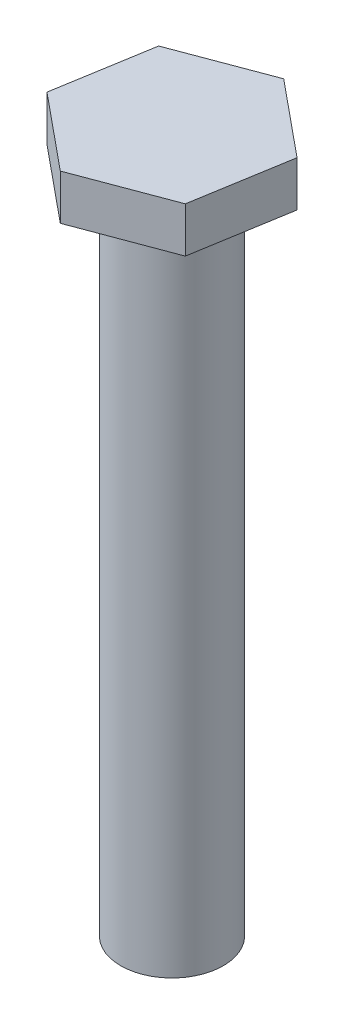
ISO-10303-21;
HEADER;
FILE_DESCRIPTION(('STEP AP214'),'2;1');
FILE_NAME('part.step','',(''),(''),'','','');
FILE_SCHEMA(('AUTOMOTIVE_DESIGN { 1 0 10303 214 1 1 1 1 }'));
ENDSEC;
DATA;
#1=APPLICATION_CONTEXT('core data for automotive mechanical design processes');
#2=APPLICATION_PROTOCOL_DEFINITION('international standard','automotive_design',2000,#1);
#3=PRODUCT_CONTEXT('',#1,'mechanical');
#4=PRODUCT('Part','Part','',(#3));
#5=PRODUCT_RELATED_PRODUCT_CATEGORY('part','',(#4));
#6=PRODUCT_DEFINITION_FORMATION('','',#4);
#7=PRODUCT_DEFINITION_CONTEXT('part definition',#1,'design');
#8=PRODUCT_DEFINITION('design','',#6,#7);
#9=PRODUCT_DEFINITION_SHAPE('','',#8);
#10=(LENGTH_UNIT() NAMED_UNIT(*) SI_UNIT(.MILLI.,.METRE.));
#11=(NAMED_UNIT(*) PLANE_ANGLE_UNIT() SI_UNIT($,.RADIAN.));
#12=(NAMED_UNIT(*) SI_UNIT($,.STERADIAN.) SOLID_ANGLE_UNIT());
#13=UNCERTAINTY_MEASURE_WITH_UNIT(LENGTH_MEASURE(1.E-05),#10,'distance_accuracy_value','');
#14=(GEOMETRIC_REPRESENTATION_CONTEXT(3) GLOBAL_UNCERTAINTY_ASSIGNED_CONTEXT((#13)) GLOBAL_UNIT_ASSIGNED_CONTEXT((#10,
#11,#12)) REPRESENTATION_CONTEXT('',''));
#15=CARTESIAN_POINT('',(0.,0.,0.));
#16=DIRECTION('',(0.,0.,1.));
#17=DIRECTION('',(1.,0.,0.));
#18=AXIS2_PLACEMENT_3D('',#15,#16,#17);
#19=CARTESIAN_POINT('',(0.,-101.6,0.));
#20=DIRECTION('',(0.,1.,0.));
#21=DIRECTION('',(0.,0.,1.));
#22=AXIS2_PLACEMENT_3D('',#19,#20,#21);
#23=CYLINDRICAL_SURFACE('',#22,7.9375);
#24=CARTESIAN_POINT('',(0.,-101.6,0.));
#25=DIRECTION('',(0.,1.,0.));
#26=DIRECTION('',(0.,0.,1.));
#27=AXIS2_PLACEMENT_3D('',#24,#25,#26);
#28=CIRCLE('',#27,7.9375);
#29=CARTESIAN_POINT('',(0.,-101.6,7.9375));
#30=VERTEX_POINT('',#29);
#31=EDGE_CURVE('E11',#30,#30,#28,.T.);
#32=CARTESIAN_POINT('',(0.,0.,0.));
#33=DIRECTION('',(0.,1.,0.));
#34=DIRECTION('',(0.,0.,1.));
#35=AXIS2_PLACEMENT_3D('',#32,#33,#34);
#36=CIRCLE('',#35,7.9375);
#37=CARTESIAN_POINT('',(0.,0.,7.9375));
#38=VERTEX_POINT('',#37);
#39=EDGE_CURVE('E35',#38,#38,#36,.T.);
#40=CARTESIAN_POINT('',(0.,-101.6,7.9375));
#41=CARTESIAN_POINT('',(0.,-100.541666666667,7.9375));
#42=CARTESIAN_POINT('',(0.,-99.4833333333333,7.9375));
#43=CARTESIAN_POINT('',(0.,-97.3666666666667,7.9375));
#44=CARTESIAN_POINT('',(0.,-96.3083333333333,7.9375));
#45=CARTESIAN_POINT('',(0.,-94.1916666666667,7.9375));
#46=CARTESIAN_POINT('',(0.,-93.1333333333333,7.9375));
#47=CARTESIAN_POINT('',(0.,-91.0166666666667,7.9375));
#48=CARTESIAN_POINT('',(0.,-89.9583333333333,7.9375));
#49=CARTESIAN_POINT('',(0.,-87.8416666666667,7.9375));
#50=CARTESIAN_POINT('',(0.,-86.7833333333333,7.9375));
#51=CARTESIAN_POINT('',(0.,-84.6666666666667,7.9375));
#52=CARTESIAN_POINT('',(0.,-83.6083333333333,7.9375));
#53=CARTESIAN_POINT('',(0.,-81.4916666666667,7.9375));
#54=CARTESIAN_POINT('',(0.,-80.4333333333333,7.9375));
#55=CARTESIAN_POINT('',(0.,-78.3166666666667,7.9375));
#56=CARTESIAN_POINT('',(0.,-77.2583333333333,7.9375));
#57=CARTESIAN_POINT('',(0.,-75.1416666666667,7.9375));
#58=CARTESIAN_POINT('',(0.,-74.0833333333333,7.9375));
#59=CARTESIAN_POINT('',(0.,-71.9666666666667,7.9375));
#60=CARTESIAN_POINT('',(0.,-70.9083333333333,7.9375));
#61=CARTESIAN_POINT('',(0.,-68.7916666666667,7.9375));
#62=CARTESIAN_POINT('',(0.,-67.7333333333333,7.9375));
#63=CARTESIAN_POINT('',(0.,-65.6166666666667,7.9375));
#64=CARTESIAN_POINT('',(0.,-64.5583333333333,7.9375));
#65=CARTESIAN_POINT('',(0.,-62.4416666666667,7.9375));
#66=CARTESIAN_POINT('',(0.,-61.3833333333333,7.9375));
#67=CARTESIAN_POINT('',(0.,-59.2666666666667,7.9375));
#68=CARTESIAN_POINT('',(0.,-58.2083333333333,7.9375));
#69=CARTESIAN_POINT('',(0.,-56.0916666666667,7.9375));
#70=CARTESIAN_POINT('',(0.,-55.0333333333333,7.9375));
#71=CARTESIAN_POINT('',(0.,-52.9166666666667,7.9375));
#72=CARTESIAN_POINT('',(0.,-51.8583333333333,7.9375));
#73=CARTESIAN_POINT('',(0.,-49.7416666666667,7.9375));
#74=CARTESIAN_POINT('',(0.,-48.6833333333333,7.9375));
#75=CARTESIAN_POINT('',(0.,-46.5666666666667,7.9375));
#76=CARTESIAN_POINT('',(0.,-45.5083333333333,7.9375));
#77=CARTESIAN_POINT('',(0.,-43.3916666666667,7.9375));
#78=CARTESIAN_POINT('',(0.,-42.3333333333333,7.9375));
#79=CARTESIAN_POINT('',(0.,-40.2166666666667,7.9375));
#80=CARTESIAN_POINT('',(0.,-39.1583333333333,7.9375));
#81=CARTESIAN_POINT('',(0.,-37.0416666666667,7.9375));
#82=CARTESIAN_POINT('',(0.,-35.9833333333333,7.9375));
#83=CARTESIAN_POINT('',(0.,-33.8666666666667,7.9375));
#84=CARTESIAN_POINT('',(0.,-32.8083333333334,7.9375));
#85=CARTESIAN_POINT('',(0.,-30.6916666666667,7.9375));
#86=CARTESIAN_POINT('',(0.,-29.6333333333333,7.9375));
#87=CARTESIAN_POINT('',(0.,-27.5166666666667,7.9375));
#88=CARTESIAN_POINT('',(0.,-26.4583333333333,7.9375));
#89=CARTESIAN_POINT('',(0.,-24.3416666666667,7.9375));
#90=CARTESIAN_POINT('',(0.,-23.2833333333333,7.9375));
#91=CARTESIAN_POINT('',(0.,-21.1666666666667,7.9375));
#92=CARTESIAN_POINT('',(0.,-20.1083333333333,7.9375));
#93=CARTESIAN_POINT('',(0.,-17.9916666666667,7.9375));
#94=CARTESIAN_POINT('',(0.,-16.9333333333333,7.9375));
#95=CARTESIAN_POINT('',(0.,-14.8166666666667,7.9375));
#96=CARTESIAN_POINT('',(0.,-13.7583333333333,7.9375));
#97=CARTESIAN_POINT('',(0.,-11.6416666666667,7.9375));
#98=CARTESIAN_POINT('',(0.,-10.5833333333333,7.9375));
#99=CARTESIAN_POINT('',(0.,-8.46666666666667,7.9375));
#100=CARTESIAN_POINT('',(0.,-7.40833333333334,7.9375));
#101=CARTESIAN_POINT('',(0.,-5.29166666666667,7.9375));
#102=CARTESIAN_POINT('',(0.,-4.23333333333333,7.9375));
#103=CARTESIAN_POINT('',(0.,-2.11666666666666,7.9375));
#104=CARTESIAN_POINT('',(0.,-1.05833333333333,7.9375));
#105=CARTESIAN_POINT('',(0.,0.,7.9375));
#106=B_SPLINE_CURVE_WITH_KNOTS('',3,(#40,#41,#42,#43,#44,#45,#46,#47,#48,#49,#50,#51,#52,#53,
#54,#55,#56,#57,#58,#59,#60,#61,#62,#63,#64,#65,#66,#67,#68,#69,#70,#71,#72,#73,#74,#75,#76,#77,
#78,#79,#80,#81,#82,#83,#84,#85,#86,#87,#88,#89,#90,#91,#92,#93,#94,#95,#96,#97,#98,#99,#100,
#101,#102,#103,#104,#105),.UNSPECIFIED.,.F.,.F.,(4,2,2,2,2,2,2,2,2,2,2,2,2,2,2,2,2,2,2,2,2,2,2,
2,2,2,2,2,2,2,2,2,4),(0.,3.17500000000001,6.35000000000001,9.52500000000001,12.7,15.875,19.05,
22.225,25.4,28.575,31.75,34.925,38.1,41.275,44.45,47.625,50.8,53.975,57.15,60.325,63.5,66.675,
69.85,73.025,76.2,79.375,82.55,85.725,88.9,92.075,95.25,98.425,101.6),.UNSPECIFIED.);
#107=EDGE_CURVE('BSEAM32',#30,#38,#106,.T.);
#108=ORIENTED_EDGE('',*,*,#31,.T.);
#109=ORIENTED_EDGE('',*,*,#39,.F.);
#110=ORIENTED_EDGE('',*,*,#107,.T.);
#111=ORIENTED_EDGE('',*,*,#107,.F.);
#112=EDGE_LOOP('',(#108,#110,#109,#111));
#113=FACE_BOUND('',#112,.T.);
#114=ADVANCED_FACE('F32',(#113),#23,.T.);
#115=CARTESIAN_POINT('',(0.,-101.6,0.));
#116=DIRECTION('',(0.,1.,0.));
#117=DIRECTION('',(0.,0.,1.));
#118=AXIS2_PLACEMENT_3D('',#115,#116,#117);
#119=PLANE('',#118);
#120=ORIENTED_EDGE('',*,*,#31,.F.);
#121=EDGE_LOOP('',(#120));
#122=FACE_BOUND('',#121,.T.);
#123=ADVANCED_FACE('F143',(#122),#119,.F.);
#124=CARTESIAN_POINT('',(-2.45878019902812,7.,14.8083670020094));
#125=DIRECTION('',(-0.351394296683121,0.,-0.936227562219023));
#126=DIRECTION('',(-0.936227562219023,0.,0.351394296683121));
#127=AXIS2_PLACEMENT_3D('',#124,#125,#126);
#128=PLANE('',#127);
#129=DIRECTION('',(0.936227562219023,0.,-0.351394296683121));
#130=VECTOR('',#129,1.);
#131=CARTESIAN_POINT('',(-2.45878019902812,0.,14.8083670020094));
#132=LINE('',#131,#130);
#133=CARTESIAN_POINT('',(-2.45878019902812,0.,14.8083670020094));
#134=VERTEX_POINT('',#133);
#135=CARTESIAN_POINT('',(11.5950319127893,0.,9.5335496156852));
#136=VERTEX_POINT('',#135);
#137=EDGE_CURVE('E117',#134,#136,#132,.T.);
#138=ORIENTED_EDGE('',*,*,#137,.T.);
#139=DIRECTION('',(0.,-1.,0.));
#140=VECTOR('',#139,1.);
#141=CARTESIAN_POINT('',(11.5950319127893,7.,9.5335496156852));
#142=LINE('',#141,#140);
#143=CARTESIAN_POINT('',(11.5950319127893,7.,9.5335496156852));
#144=VERTEX_POINT('',#143);
#145=EDGE_CURVE('E134',#144,#136,#142,.T.);
#146=ORIENTED_EDGE('',*,*,#145,.F.);
#147=DIRECTION('',(0.936227562219023,0.,-0.351394296683121));
#148=VECTOR('',#147,1.);
#149=CARTESIAN_POINT('',(-2.45878019902812,7.,14.8083670020094));
#150=LINE('',#149,#148);
#151=CARTESIAN_POINT('',(-2.45878019902812,7.,14.8083670020094));
#152=VERTEX_POINT('',#151);
#153=EDGE_CURVE('E127',#152,#144,#150,.T.);
#154=ORIENTED_EDGE('',*,*,#153,.F.);
#155=DIRECTION('',(0.,-1.,0.));
#156=VECTOR('',#155,1.);
#157=CARTESIAN_POINT('',(-2.45878019902812,7.,14.8083670020094));
#158=LINE('',#157,#156);
#159=EDGE_CURVE('E113',#152,#134,#158,.T.);
#160=ORIENTED_EDGE('',*,*,#159,.T.);
#161=EDGE_LOOP('',(#138,#146,#154,#160));
#162=FACE_BOUND('',#161,.T.);
#163=ADVANCED_FACE('F148',(#162),#128,.F.);
#164=CARTESIAN_POINT('',(11.5950319127893,7.,9.5335496156852));
#165=DIRECTION('',(-0.986494000946411,0.,-0.163797393436962));
#166=DIRECTION('',(-0.163797393436962,0.,0.986494000946411));
#167=AXIS2_PLACEMENT_3D('',#164,#165,#166);
#168=PLANE('',#167);
#169=DIRECTION('',(0.163797393436962,0.,-0.986494000946411));
#170=VECTOR('',#169,1.);
#171=CARTESIAN_POINT('',(11.5950319127893,0.,9.5335496156852));
#172=LINE('',#171,#170);
#173=CARTESIAN_POINT('',(14.0538121118174,0.,-5.27481738632418));
#174=VERTEX_POINT('',#173);
#175=EDGE_CURVE('E120',#136,#174,#172,.T.);
#176=ORIENTED_EDGE('',*,*,#175,.T.);
#177=DIRECTION('',(0.,-1.,0.));
#178=VECTOR('',#177,1.);
#179=CARTESIAN_POINT('',(14.0538121118174,7.,-5.27481738632418));
#180=LINE('',#179,#178);
#181=CARTESIAN_POINT('',(14.0538121118174,7.,-5.27481738632418));
#182=VERTEX_POINT('',#181);
#183=EDGE_CURVE('E131',#182,#174,#180,.T.);
#184=ORIENTED_EDGE('',*,*,#183,.F.);
#185=DIRECTION('',(0.163797393436962,0.,-0.986494000946411));
#186=VECTOR('',#185,1.);
#187=CARTESIAN_POINT('',(11.5950319127893,7.,9.5335496156852));
#188=LINE('',#187,#186);
#189=EDGE_CURVE('E86',#144,#182,#188,.T.);
#190=ORIENTED_EDGE('',*,*,#189,.F.);
#191=ORIENTED_EDGE('',*,*,#145,.T.);
#192=EDGE_LOOP('',(#176,#184,#190,#191));
#193=FACE_BOUND('',#192,.T.);
#194=ADVANCED_FACE('F154',(#193),#168,.F.);
#195=CARTESIAN_POINT('',(14.0538121118174,7.,-5.27481738632418));
#196=DIRECTION('',(-0.63509970426329,0.,0.77243016878206));
#197=DIRECTION('',(0.77243016878206,0.,0.63509970426329));
#198=AXIS2_PLACEMENT_3D('',#195,#196,#197);
#199=PLANE('',#198);
#200=DIRECTION('',(-0.77243016878206,0.,-0.635099704263289));
#201=VECTOR('',#200,1.);
#202=CARTESIAN_POINT('',(14.0538121118174,0.,-5.27481738632418));
#203=LINE('',#202,#201);
#204=CARTESIAN_POINT('',(2.45878019902812,0.,-14.8083670020094));
#205=VERTEX_POINT('',#204);
#206=EDGE_CURVE('E122',#174,#205,#203,.T.);
#207=ORIENTED_EDGE('',*,*,#206,.T.);
#208=DIRECTION('',(0.,-1.,0.));
#209=VECTOR('',#208,1.);
#210=CARTESIAN_POINT('',(2.45878019902812,7.,-14.8083670020094));
#211=LINE('',#210,#209);
#212=CARTESIAN_POINT('',(2.45878019902812,7.,-14.8083670020094));
#213=VERTEX_POINT('',#212);
#214=EDGE_CURVE('E108',#213,#205,#211,.T.);
#215=ORIENTED_EDGE('',*,*,#214,.F.);
#216=DIRECTION('',(-0.77243016878206,0.,-0.635099704263289));
#217=VECTOR('',#216,1.);
#218=CARTESIAN_POINT('',(14.0538121118174,7.,-5.27481738632418));
#219=LINE('',#218,#217);
#220=EDGE_CURVE('E99',#182,#213,#219,.T.);
#221=ORIENTED_EDGE('',*,*,#220,.F.);
#222=ORIENTED_EDGE('',*,*,#183,.T.);
#223=EDGE_LOOP('',(#207,#215,#221,#222));
#224=FACE_BOUND('',#223,.T.);
#225=ADVANCED_FACE('F160',(#224),#199,.F.);
#226=CARTESIAN_POINT('',(2.45878019902812,7.,-14.8083670020094));
#227=DIRECTION('',(0.351394296683121,0.,0.936227562219023));
#228=DIRECTION('',(0.936227562219023,0.,-0.351394296683121));
#229=AXIS2_PLACEMENT_3D('',#226,#227,#228);
#230=PLANE('',#229);
#231=DIRECTION('',(-0.936227562219023,0.,0.351394296683121));
#232=VECTOR('',#231,1.);
#233=CARTESIAN_POINT('',(2.45878019902812,0.,-14.8083670020094));
#234=LINE('',#233,#232);
#235=CARTESIAN_POINT('',(-11.5950319127893,0.,-9.53354961568521));
#236=VERTEX_POINT('',#235);
#237=EDGE_CURVE('E107',#205,#236,#234,.T.);
#238=ORIENTED_EDGE('',*,*,#237,.T.);
#239=DIRECTION('',(0.,-1.,0.));
#240=VECTOR('',#239,1.);
#241=CARTESIAN_POINT('',(-11.5950319127893,7.,-9.53354961568521));
#242=LINE('',#241,#240);
#243=CARTESIAN_POINT('',(-11.5950319127893,7.,-9.53354961568521));
#244=VERTEX_POINT('',#243);
#245=EDGE_CURVE('E104',#244,#236,#242,.T.);
#246=ORIENTED_EDGE('',*,*,#245,.F.);
#247=DIRECTION('',(-0.936227562219023,0.,0.351394296683121));
#248=VECTOR('',#247,1.);
#249=CARTESIAN_POINT('',(2.45878019902812,7.,-14.8083670020094));
#250=LINE('',#249,#248);
#251=EDGE_CURVE('E93',#213,#244,#250,.T.);
#252=ORIENTED_EDGE('',*,*,#251,.F.);
#253=ORIENTED_EDGE('',*,*,#214,.T.);
#254=EDGE_LOOP('',(#238,#246,#252,#253));
#255=FACE_BOUND('',#254,.T.);
#256=ADVANCED_FACE('F105',(#255),#230,.F.);
#257=CARTESIAN_POINT('',(-11.5950319127893,7.,-9.53354961568521));
#258=DIRECTION('',(0.986494000946411,0.,0.163797393436963));
#259=DIRECTION('',(0.163797393436963,0.,-0.986494000946411));
#260=AXIS2_PLACEMENT_3D('',#257,#258,#259);
#261=PLANE('',#260);
#262=DIRECTION('',(-0.163797393436963,0.,0.986494000946411));
#263=VECTOR('',#262,1.);
#264=CARTESIAN_POINT('',(-11.5950319127893,0.,-9.53354961568521));
#265=LINE('',#264,#263);
#266=CARTESIAN_POINT('',(-14.0538121118174,0.,5.27481738632418));
#267=VERTEX_POINT('',#266);
#268=EDGE_CURVE('E71',#236,#267,#265,.T.);
#269=ORIENTED_EDGE('',*,*,#268,.T.);
#270=DIRECTION('',(0.,-1.,0.));
#271=VECTOR('',#270,1.);
#272=CARTESIAN_POINT('',(-14.0538121118174,7.,5.27481738632418));
#273=LINE('',#272,#271);
#274=CARTESIAN_POINT('',(-14.0538121118174,7.,5.27481738632418));
#275=VERTEX_POINT('',#274);
#276=EDGE_CURVE('E109',#275,#267,#273,.T.);
#277=ORIENTED_EDGE('',*,*,#276,.F.);
#278=DIRECTION('',(-0.163797393436963,0.,0.986494000946411));
#279=VECTOR('',#278,1.);
#280=CARTESIAN_POINT('',(-11.5950319127893,7.,-9.53354961568521));
#281=LINE('',#280,#279);
#282=EDGE_CURVE('E97',#244,#275,#281,.T.);
#283=ORIENTED_EDGE('',*,*,#282,.F.);
#284=ORIENTED_EDGE('',*,*,#245,.T.);
#285=EDGE_LOOP('',(#269,#277,#283,#284));
#286=FACE_BOUND('',#285,.T.);
#287=ADVANCED_FACE('F111',(#286),#261,.F.);
#288=CARTESIAN_POINT('',(-14.0538121118174,7.,5.27481738632418));
#289=DIRECTION('',(0.635099704263289,0.,-0.77243016878206));
#290=DIRECTION('',(-0.772430168782061,0.,-0.635099704263289));
#291=AXIS2_PLACEMENT_3D('',#288,#289,#290);
#292=PLANE('',#291);
#293=DIRECTION('',(0.77243016878206,0.,0.635099704263289));
#294=VECTOR('',#293,1.);
#295=CARTESIAN_POINT('',(-14.0538121118174,0.,5.27481738632418));
#296=LINE('',#295,#294);
#297=EDGE_CURVE('E77',#267,#134,#296,.T.);
#298=ORIENTED_EDGE('',*,*,#297,.T.);
#299=ORIENTED_EDGE('',*,*,#159,.F.);
#300=DIRECTION('',(0.77243016878206,0.,0.635099704263289));
#301=VECTOR('',#300,1.);
#302=CARTESIAN_POINT('',(-14.0538121118174,7.,5.27481738632418));
#303=LINE('',#302,#301);
#304=EDGE_CURVE('E48',#275,#152,#303,.T.);
#305=ORIENTED_EDGE('',*,*,#304,.F.);
#306=ORIENTED_EDGE('',*,*,#276,.T.);
#307=EDGE_LOOP('',(#298,#299,#305,#306));
#308=FACE_BOUND('',#307,.T.);
#309=ADVANCED_FACE('F168',(#308),#292,.F.);
#310=CARTESIAN_POINT('',(0.,7.,0.));
#311=DIRECTION('',(0.,1.,0.));
#312=DIRECTION('',(0.,0.,1.));
#313=AXIS2_PLACEMENT_3D('',#310,#311,#312);
#314=PLANE('',#313);
#315=ORIENTED_EDGE('',*,*,#153,.T.);
#316=ORIENTED_EDGE('',*,*,#189,.T.);
#317=ORIENTED_EDGE('',*,*,#220,.T.);
#318=ORIENTED_EDGE('',*,*,#251,.T.);
#319=ORIENTED_EDGE('',*,*,#282,.T.);
#320=ORIENTED_EDGE('',*,*,#304,.T.);
#321=EDGE_LOOP('',(#315,#316,#317,#318,#319,#320));
#322=FACE_BOUND('',#321,.T.);
#323=ADVANCED_FACE('F95',(#322),#314,.T.);
#324=CARTESIAN_POINT('',(0.,0.,0.));
#325=DIRECTION('',(0.,1.,0.));
#326=DIRECTION('',(0.,0.,1.));
#327=AXIS2_PLACEMENT_3D('',#324,#325,#326);
#328=PLANE('',#327);
#329=ORIENTED_EDGE('',*,*,#39,.T.);
#330=EDGE_LOOP('',(#329));
#331=FACE_BOUND('',#330,.T.);
#332=ORIENTED_EDGE('',*,*,#137,.F.);
#333=ORIENTED_EDGE('',*,*,#297,.F.);
#334=ORIENTED_EDGE('',*,*,#268,.F.);
#335=ORIENTED_EDGE('',*,*,#237,.F.);
#336=ORIENTED_EDGE('',*,*,#206,.F.);
#337=ORIENTED_EDGE('',*,*,#175,.F.);
#338=EDGE_LOOP('',(#332,#333,#334,#335,#336,#337));
#339=FACE_BOUND('',#338,.T.);
#340=ADVANCED_FACE('F139',(#331,#339),#328,.F.);
#341=CLOSED_SHELL('',(#114,#123,#163,#194,#225,#256,#287,#309,#323,#340));
#342=MANIFOLD_SOLID_BREP('B2',#341);
#343=ADVANCED_BREP_SHAPE_REPRESENTATION('',(#18,#342),#14);
#344=SHAPE_DEFINITION_REPRESENTATION(#9,#343);
ENDSEC;
END-ISO-10303-21;
